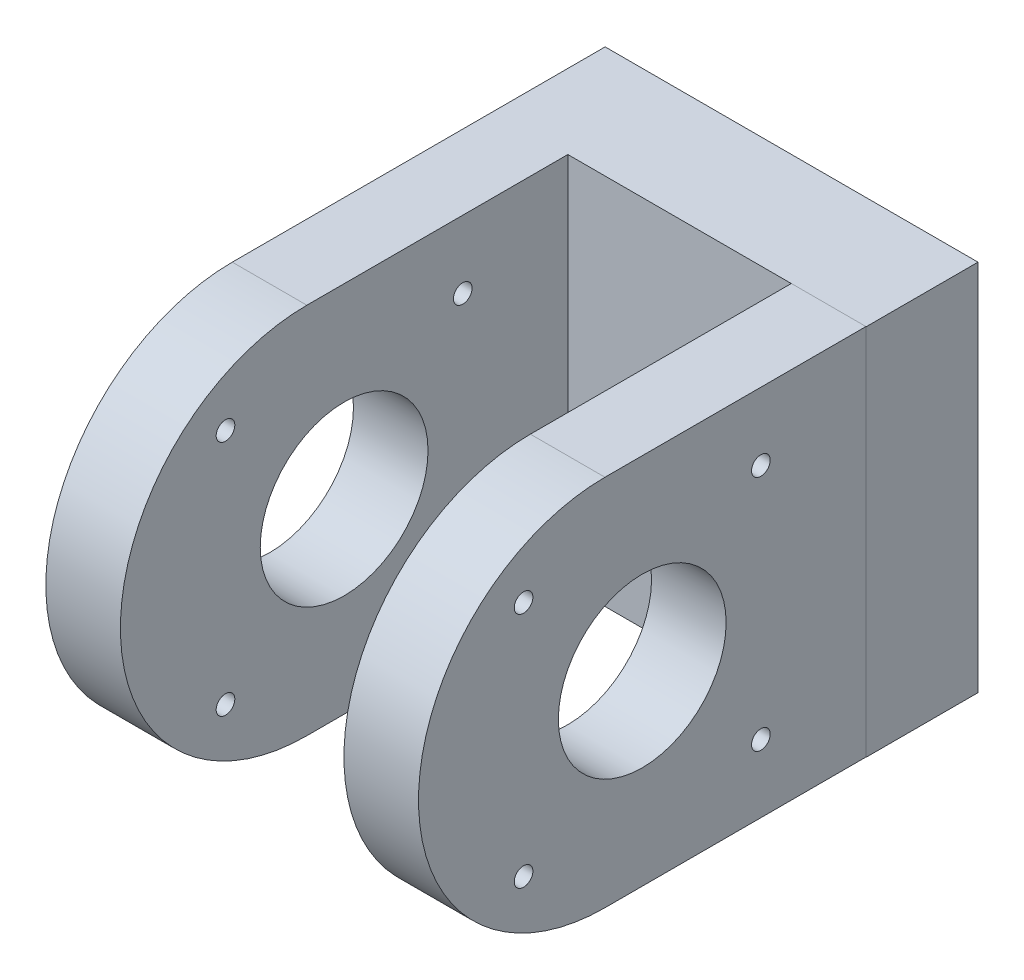
ISO-10303-21;
HEADER;
FILE_DESCRIPTION(('STEP AP214'),'2;1');
FILE_NAME('part.step','',(''),(''),'','','');
FILE_SCHEMA(('AUTOMOTIVE_DESIGN { 1 0 10303 214 1 1 1 1 }'));
ENDSEC;
DATA;
#1=APPLICATION_CONTEXT('core data for automotive mechanical design processes');
#2=APPLICATION_PROTOCOL_DEFINITION('international standard','automotive_design',2000,#1);
#3=PRODUCT_CONTEXT('',#1,'mechanical');
#4=PRODUCT('Part','Part','',(#3));
#5=PRODUCT_RELATED_PRODUCT_CATEGORY('part','',(#4));
#6=PRODUCT_DEFINITION_FORMATION('','',#4);
#7=PRODUCT_DEFINITION_CONTEXT('part definition',#1,'design');
#8=PRODUCT_DEFINITION('design','',#6,#7);
#9=PRODUCT_DEFINITION_SHAPE('','',#8);
#10=(LENGTH_UNIT() NAMED_UNIT(*) SI_UNIT(.MILLI.,.METRE.));
#11=(NAMED_UNIT(*) PLANE_ANGLE_UNIT() SI_UNIT($,.RADIAN.));
#12=(NAMED_UNIT(*) SI_UNIT($,.STERADIAN.) SOLID_ANGLE_UNIT());
#13=UNCERTAINTY_MEASURE_WITH_UNIT(LENGTH_MEASURE(1.E-05),#10,'distance_accuracy_value','');
#14=(GEOMETRIC_REPRESENTATION_CONTEXT(3) GLOBAL_UNCERTAINTY_ASSIGNED_CONTEXT((#13)) GLOBAL_UNIT_ASSIGNED_CONTEXT((#10,
#11,#12)) REPRESENTATION_CONTEXT('',''));
#15=CARTESIAN_POINT('',(0.,0.,0.));
#16=DIRECTION('',(0.,0.,1.));
#17=DIRECTION('',(1.,0.,0.));
#18=AXIS2_PLACEMENT_3D('',#15,#16,#17);
#19=CARTESIAN_POINT('',(15.,0.0348190205668461,50.0259957470013));
#20=DIRECTION('',(1.,0.,0.));
#21=DIRECTION('',(0.,0.,-1.));
#22=AXIS2_PLACEMENT_3D('',#19,#20,#21);
#23=CYLINDRICAL_SURFACE('',#22,25.);
#24=CARTESIAN_POINT('',(25.,0.0348190205668461,50.0259957470013));
#25=DIRECTION('',(1.,0.,0.));
#26=DIRECTION('',(0.,0.,-1.));
#27=AXIS2_PLACEMENT_3D('',#24,#25,#26);
#28=CIRCLE('',#27,25.);
#29=CARTESIAN_POINT('',(25.,-24.9651809794331,50.0259957470013));
#30=VERTEX_POINT('',#29);
#31=CARTESIAN_POINT('',(25.,25.0348190205668,50.0259957470013));
#32=VERTEX_POINT('',#31);
#33=EDGE_CURVE('E222',#30,#32,#28,.F.);
#34=ORIENTED_EDGE('',*,*,#33,.T.);
#35=DIRECTION('',(1.,0.,0.));
#36=VECTOR('',#35,1.);
#37=CARTESIAN_POINT('',(15.,25.0348190205668,50.0259957470013));
#38=LINE('',#37,#36);
#39=CARTESIAN_POINT('',(15.,25.0348190205668,50.0259957470013));
#40=VERTEX_POINT('',#39);
#41=EDGE_CURVE('E13',#40,#32,#38,.T.);
#42=ORIENTED_EDGE('',*,*,#41,.F.);
#43=CARTESIAN_POINT('',(15.,0.0348190205668461,50.0259957470013));
#44=DIRECTION('',(1.,0.,0.));
#45=DIRECTION('',(0.,0.,-1.));
#46=AXIS2_PLACEMENT_3D('',#43,#44,#45);
#47=CIRCLE('',#46,25.);
#48=CARTESIAN_POINT('',(15.,-24.9651809794331,50.0259957470013));
#49=VERTEX_POINT('',#48);
#50=EDGE_CURVE('E160',#49,#40,#47,.F.);
#51=ORIENTED_EDGE('',*,*,#50,.F.);
#52=DIRECTION('',(1.,0.,0.));
#53=VECTOR('',#52,1.);
#54=CARTESIAN_POINT('',(15.,-24.9651809794331,50.0259957470013));
#55=LINE('',#54,#53);
#56=EDGE_CURVE('E145',#49,#30,#55,.T.);
#57=ORIENTED_EDGE('',*,*,#56,.T.);
#58=EDGE_LOOP('',(#34,#42,#51,#57));
#59=FACE_BOUND('',#58,.T.);
#60=ADVANCED_FACE('F141',(#59),#23,.T.);
#61=CARTESIAN_POINT('',(15.,25.0348190205668,0.));
#62=DIRECTION('',(0.,1.,0.));
#63=DIRECTION('',(0.,0.,1.));
#64=AXIS2_PLACEMENT_3D('',#61,#62,#63);
#65=PLANE('',#64);
#66=DIRECTION('',(0.,0.,1.));
#67=VECTOR('',#66,1.);
#68=CARTESIAN_POINT('',(25.,25.0348190205668,0.));
#69=LINE('',#68,#67);
#70=CARTESIAN_POINT('',(25.,25.0348190205668,15.0259957470013));
#71=VERTEX_POINT('',#70);
#72=EDGE_CURVE('E227',#71,#32,#69,.T.);
#73=ORIENTED_EDGE('',*,*,#72,.F.);
#74=DIRECTION('',(1.,0.,0.));
#75=VECTOR('',#74,1.);
#76=CARTESIAN_POINT('',(15.,25.0348190205668,15.0259957470013));
#77=LINE('',#76,#75);
#78=CARTESIAN_POINT('',(15.,25.0348190205668,15.0259957470013));
#79=VERTEX_POINT('',#78);
#80=EDGE_CURVE('E151',#79,#71,#77,.T.);
#81=ORIENTED_EDGE('',*,*,#80,.F.);
#82=DIRECTION('',(0.,0.,1.));
#83=VECTOR('',#82,1.);
#84=CARTESIAN_POINT('',(15.,25.0348190205668,0.));
#85=LINE('',#84,#83);
#86=EDGE_CURVE('E191',#79,#40,#85,.T.);
#87=ORIENTED_EDGE('',*,*,#86,.T.);
#88=ORIENTED_EDGE('',*,*,#41,.T.);
#89=EDGE_LOOP('',(#73,#81,#87,#88));
#90=FACE_BOUND('',#89,.T.);
#91=ADVANCED_FACE('F267',(#90),#65,.T.);
#92=CARTESIAN_POINT('',(15.,0.,15.0259957470013));
#93=DIRECTION('',(0.,0.,1.));
#94=DIRECTION('',(1.,0.,0.));
#95=AXIS2_PLACEMENT_3D('',#92,#93,#94);
#96=PLANE('',#95);
#97=DIRECTION('',(0.,-1.,0.));
#98=VECTOR('',#97,1.);
#99=CARTESIAN_POINT('',(25.,0.,15.0259957470013));
#100=LINE('',#99,#98);
#101=CARTESIAN_POINT('',(25.,-24.9651809794331,15.0259957470013));
#102=VERTEX_POINT('',#101);
#103=EDGE_CURVE('E196',#71,#102,#100,.T.);
#104=ORIENTED_EDGE('',*,*,#103,.T.);
#105=DIRECTION('',(1.,0.,0.));
#106=VECTOR('',#105,1.);
#107=CARTESIAN_POINT('',(15.,-24.9651809794331,15.0259957470013));
#108=LINE('',#107,#106);
#109=CARTESIAN_POINT('',(15.,-24.9651809794331,15.0259957470013));
#110=VERTEX_POINT('',#109);
#111=EDGE_CURVE('E194',#110,#102,#108,.T.);
#112=ORIENTED_EDGE('',*,*,#111,.F.);
#113=DIRECTION('',(0.,-1.,0.));
#114=VECTOR('',#113,1.);
#115=CARTESIAN_POINT('',(15.,0.,15.0259957470013));
#116=LINE('',#115,#114);
#117=EDGE_CURVE('E187',#79,#110,#116,.T.);
#118=ORIENTED_EDGE('',*,*,#117,.F.);
#119=ORIENTED_EDGE('',*,*,#80,.T.);
#120=EDGE_LOOP('',(#104,#112,#118,#119));
#121=FACE_BOUND('',#120,.T.);
#122=ADVANCED_FACE('F195',(#121),#96,.F.);
#123=CARTESIAN_POINT('',(15.,-24.9651809794331,0.));
#124=DIRECTION('',(0.,1.,0.));
#125=DIRECTION('',(0.,0.,1.));
#126=AXIS2_PLACEMENT_3D('',#123,#124,#125);
#127=PLANE('',#126);
#128=DIRECTION('',(0.,0.,1.));
#129=VECTOR('',#128,1.);
#130=CARTESIAN_POINT('',(25.,-24.9651809794331,0.));
#131=LINE('',#130,#129);
#132=EDGE_CURVE('E224',#102,#30,#131,.T.);
#133=ORIENTED_EDGE('',*,*,#132,.T.);
#134=ORIENTED_EDGE('',*,*,#56,.F.);
#135=DIRECTION('',(0.,0.,1.));
#136=VECTOR('',#135,1.);
#137=CARTESIAN_POINT('',(15.,-24.9651809794331,0.));
#138=LINE('',#137,#136);
#139=EDGE_CURVE('E185',#110,#49,#138,.T.);
#140=ORIENTED_EDGE('',*,*,#139,.F.);
#141=ORIENTED_EDGE('',*,*,#111,.T.);
#142=EDGE_LOOP('',(#133,#134,#140,#141));
#143=FACE_BOUND('',#142,.T.);
#144=ADVANCED_FACE('F199',(#143),#127,.F.);
#145=CARTESIAN_POINT('',(15.,15.9447215972642,29.116093170304));
#146=DIRECTION('',(1.,0.,0.));
#147=DIRECTION('',(0.,0.,-1.));
#148=AXIS2_PLACEMENT_3D('',#145,#146,#147);
#149=CYLINDRICAL_SURFACE('',#148,1.25);
#150=CARTESIAN_POINT('',(15.,15.9447215972642,29.116093170304));
#151=DIRECTION('',(1.,0.,0.));
#152=DIRECTION('',(0.,0.,-1.));
#153=AXIS2_PLACEMENT_3D('',#150,#151,#152);
#154=CIRCLE('',#153,1.25);
#155=CARTESIAN_POINT('',(15.,15.9447215972642,27.866093170304));
#156=VERTEX_POINT('',#155);
#157=EDGE_CURVE('E202',#156,#156,#154,.F.);
#158=ORIENTED_EDGE('',*,*,#157,.T.);
#159=EDGE_LOOP('',(#158));
#160=FACE_BOUND('',#159,.T.);
#161=CARTESIAN_POINT('',(25.,15.9447215972642,29.116093170304));
#162=DIRECTION('',(1.,0.,0.));
#163=DIRECTION('',(0.,0.,-1.));
#164=AXIS2_PLACEMENT_3D('',#161,#162,#163);
#165=CIRCLE('',#164,1.25);
#166=CARTESIAN_POINT('',(25.,15.9447215972642,27.866093170304));
#167=VERTEX_POINT('',#166);
#168=EDGE_CURVE('E219',#167,#167,#165,.F.);
#169=ORIENTED_EDGE('',*,*,#168,.F.);
#170=EDGE_LOOP('',(#169));
#171=FACE_BOUND('',#170,.T.);
#172=ADVANCED_FACE('F249',(#160,#171),#149,.F.);
#173=CARTESIAN_POINT('',(15.,15.9447215972642,60.9358983236986));
#174=DIRECTION('',(1.,0.,0.));
#175=DIRECTION('',(0.,0.,-1.));
#176=AXIS2_PLACEMENT_3D('',#173,#174,#175);
#177=CYLINDRICAL_SURFACE('',#176,1.25);
#178=CARTESIAN_POINT('',(15.,15.9447215972642,60.9358983236986));
#179=DIRECTION('',(1.,0.,0.));
#180=DIRECTION('',(0.,0.,-1.));
#181=AXIS2_PLACEMENT_3D('',#178,#179,#180);
#182=CIRCLE('',#181,1.25);
#183=CARTESIAN_POINT('',(15.,15.9447215972642,59.6858983236986));
#184=VERTEX_POINT('',#183);
#185=EDGE_CURVE('E242',#184,#184,#182,.F.);
#186=ORIENTED_EDGE('',*,*,#185,.T.);
#187=EDGE_LOOP('',(#186));
#188=FACE_BOUND('',#187,.T.);
#189=CARTESIAN_POINT('',(25.,15.9447215972642,60.9358983236986));
#190=DIRECTION('',(1.,0.,0.));
#191=DIRECTION('',(0.,0.,-1.));
#192=AXIS2_PLACEMENT_3D('',#189,#190,#191);
#193=CIRCLE('',#192,1.25);
#194=CARTESIAN_POINT('',(25.,15.9447215972642,59.6858983236986));
#195=VERTEX_POINT('',#194);
#196=EDGE_CURVE('E216',#195,#195,#193,.F.);
#197=ORIENTED_EDGE('',*,*,#196,.F.);
#198=EDGE_LOOP('',(#197));
#199=FACE_BOUND('',#198,.T.);
#200=ADVANCED_FACE('F279',(#188,#199),#177,.F.);
#201=CARTESIAN_POINT('',(15.,-15.8750835561305,60.9358983236986));
#202=DIRECTION('',(1.,0.,0.));
#203=DIRECTION('',(0.,0.,-1.));
#204=AXIS2_PLACEMENT_3D('',#201,#202,#203);
#205=CYLINDRICAL_SURFACE('',#204,1.25);
#206=CARTESIAN_POINT('',(15.,-15.8750835561305,60.9358983236986));
#207=DIRECTION('',(1.,0.,0.));
#208=DIRECTION('',(0.,0.,-1.));
#209=AXIS2_PLACEMENT_3D('',#206,#207,#208);
#210=CIRCLE('',#209,1.25);
#211=CARTESIAN_POINT('',(15.,-15.8750835561305,59.6858983236986));
#212=VERTEX_POINT('',#211);
#213=EDGE_CURVE('E237',#212,#212,#210,.F.);
#214=ORIENTED_EDGE('',*,*,#213,.T.);
#215=EDGE_LOOP('',(#214));
#216=FACE_BOUND('',#215,.T.);
#217=CARTESIAN_POINT('',(25.,-15.8750835561305,60.9358983236986));
#218=DIRECTION('',(1.,0.,0.));
#219=DIRECTION('',(0.,0.,-1.));
#220=AXIS2_PLACEMENT_3D('',#217,#218,#219);
#221=CIRCLE('',#220,1.25);
#222=CARTESIAN_POINT('',(25.,-15.8750835561305,59.6858983236986));
#223=VERTEX_POINT('',#222);
#224=EDGE_CURVE('E213',#223,#223,#221,.F.);
#225=ORIENTED_EDGE('',*,*,#224,.F.);
#226=EDGE_LOOP('',(#225));
#227=FACE_BOUND('',#226,.T.);
#228=ADVANCED_FACE('F281',(#216,#227),#205,.F.);
#229=CARTESIAN_POINT('',(15.,-15.8750835561305,29.116093170304));
#230=DIRECTION('',(1.,0.,0.));
#231=DIRECTION('',(0.,0.,-1.));
#232=AXIS2_PLACEMENT_3D('',#229,#230,#231);
#233=CYLINDRICAL_SURFACE('',#232,1.25);
#234=CARTESIAN_POINT('',(15.,-15.8750835561305,29.116093170304));
#235=DIRECTION('',(1.,0.,0.));
#236=DIRECTION('',(0.,0.,-1.));
#237=AXIS2_PLACEMENT_3D('',#234,#235,#236);
#238=CIRCLE('',#237,1.25);
#239=CARTESIAN_POINT('',(15.,-15.8750835561305,27.866093170304));
#240=VERTEX_POINT('',#239);
#241=EDGE_CURVE('E232',#240,#240,#238,.F.);
#242=ORIENTED_EDGE('',*,*,#241,.T.);
#243=EDGE_LOOP('',(#242));
#244=FACE_BOUND('',#243,.T.);
#245=CARTESIAN_POINT('',(25.,-15.8750835561305,29.116093170304));
#246=DIRECTION('',(1.,0.,0.));
#247=DIRECTION('',(0.,0.,-1.));
#248=AXIS2_PLACEMENT_3D('',#245,#246,#247);
#249=CIRCLE('',#248,1.25);
#250=CARTESIAN_POINT('',(25.,-15.8750835561305,27.866093170304));
#251=VERTEX_POINT('',#250);
#252=EDGE_CURVE('E210',#251,#251,#249,.F.);
#253=ORIENTED_EDGE('',*,*,#252,.F.);
#254=EDGE_LOOP('',(#253));
#255=FACE_BOUND('',#254,.T.);
#256=ADVANCED_FACE('F143',(#244,#255),#233,.F.);
#257=CARTESIAN_POINT('',(15.,0.0348190205668461,45.0259957470013));
#258=DIRECTION('',(1.,0.,0.));
#259=DIRECTION('',(0.,0.,-1.));
#260=AXIS2_PLACEMENT_3D('',#257,#258,#259);
#261=CYLINDRICAL_SURFACE('',#260,11.25);
#262=CARTESIAN_POINT('',(15.,0.0348190205668461,45.0259957470013));
#263=DIRECTION('',(1.,0.,0.));
#264=DIRECTION('',(0.,0.,-1.));
#265=AXIS2_PLACEMENT_3D('',#262,#263,#264);
#266=CIRCLE('',#265,11.25);
#267=CARTESIAN_POINT('',(15.,0.0348190205668461,33.7759957470013));
#268=VERTEX_POINT('',#267);
#269=EDGE_CURVE('E207',#268,#268,#266,.F.);
#270=ORIENTED_EDGE('',*,*,#269,.T.);
#271=EDGE_LOOP('',(#270));
#272=FACE_BOUND('',#271,.T.);
#273=CARTESIAN_POINT('',(25.,0.0348190205668461,45.0259957470013));
#274=DIRECTION('',(1.,0.,0.));
#275=DIRECTION('',(0.,0.,-1.));
#276=AXIS2_PLACEMENT_3D('',#273,#274,#275);
#277=CIRCLE('',#276,11.25);
#278=CARTESIAN_POINT('',(25.,0.0348190205668461,33.7759957470013));
#279=VERTEX_POINT('',#278);
#280=EDGE_CURVE('E230',#279,#279,#277,.F.);
#281=ORIENTED_EDGE('',*,*,#280,.F.);
#282=EDGE_LOOP('',(#281));
#283=FACE_BOUND('',#282,.T.);
#284=ADVANCED_FACE('F254',(#272,#283),#261,.F.);
#285=CARTESIAN_POINT('',(15.,0.,0.));
#286=DIRECTION('',(1.,0.,0.));
#287=DIRECTION('',(0.,0.,-1.));
#288=AXIS2_PLACEMENT_3D('',#285,#286,#287);
#289=PLANE('',#288);
#290=ORIENTED_EDGE('',*,*,#241,.F.);
#291=EDGE_LOOP('',(#290));
#292=FACE_BOUND('',#291,.T.);
#293=ORIENTED_EDGE('',*,*,#213,.F.);
#294=EDGE_LOOP('',(#293));
#295=FACE_BOUND('',#294,.T.);
#296=ORIENTED_EDGE('',*,*,#185,.F.);
#297=EDGE_LOOP('',(#296));
#298=FACE_BOUND('',#297,.T.);
#299=ORIENTED_EDGE('',*,*,#157,.F.);
#300=EDGE_LOOP('',(#299));
#301=FACE_BOUND('',#300,.T.);
#302=ORIENTED_EDGE('',*,*,#50,.T.);
#303=ORIENTED_EDGE('',*,*,#86,.F.);
#304=ORIENTED_EDGE('',*,*,#117,.T.);
#305=ORIENTED_EDGE('',*,*,#139,.T.);
#306=EDGE_LOOP('',(#302,#303,#304,#305));
#307=FACE_BOUND('',#306,.T.);
#308=ORIENTED_EDGE('',*,*,#269,.F.);
#309=EDGE_LOOP('',(#308));
#310=FACE_BOUND('',#309,.T.);
#311=ADVANCED_FACE('F189',(#292,#295,#298,#301,#307,#310),#289,.F.);
#312=CARTESIAN_POINT('',(25.,0.,0.));
#313=DIRECTION('',(1.,0.,0.));
#314=DIRECTION('',(0.,0.,-1.));
#315=AXIS2_PLACEMENT_3D('',#312,#313,#314);
#316=PLANE('',#315);
#317=ORIENTED_EDGE('',*,*,#252,.T.);
#318=EDGE_LOOP('',(#317));
#319=FACE_BOUND('',#318,.T.);
#320=ORIENTED_EDGE('',*,*,#224,.T.);
#321=EDGE_LOOP('',(#320));
#322=FACE_BOUND('',#321,.T.);
#323=ORIENTED_EDGE('',*,*,#196,.T.);
#324=EDGE_LOOP('',(#323));
#325=FACE_BOUND('',#324,.T.);
#326=ORIENTED_EDGE('',*,*,#168,.T.);
#327=EDGE_LOOP('',(#326));
#328=FACE_BOUND('',#327,.T.);
#329=ORIENTED_EDGE('',*,*,#33,.F.);
#330=ORIENTED_EDGE('',*,*,#132,.F.);
#331=ORIENTED_EDGE('',*,*,#103,.F.);
#332=ORIENTED_EDGE('',*,*,#72,.T.);
#333=EDGE_LOOP('',(#329,#330,#331,#332));
#334=FACE_BOUND('',#333,.T.);
#335=ORIENTED_EDGE('',*,*,#280,.T.);
#336=EDGE_LOOP('',(#335));
#337=FACE_BOUND('',#336,.T.);
#338=ADVANCED_FACE('F253',(#319,#322,#325,#328,#334,#337),#316,.T.);
#339=CLOSED_SHELL('',(#60,#91,#122,#144,#172,#200,#228,#256,#284,#311,#338));
#340=MANIFOLD_SOLID_BREP('B2',#339);
#341=CARTESIAN_POINT('',(0.,0.,15.));
#342=DIRECTION('',(0.,0.,1.));
#343=DIRECTION('',(1.,0.,0.));
#344=AXIS2_PLACEMENT_3D('',#341,#342,#343);
#345=PLANE('',#344);
#346=CARTESIAN_POINT('',(0.,0.,15.));
#347=DIRECTION('',(0.,0.,1.));
#348=DIRECTION('',(1.,0.,0.));
#349=AXIS2_PLACEMENT_3D('',#346,#347,#348);
#350=CIRCLE('',#349,2.5);
#351=CARTESIAN_POINT('',(2.5,0.,15.));
#352=VERTEX_POINT('',#351);
#353=EDGE_CURVE('E436',#352,#352,#350,.T.);
#354=ORIENTED_EDGE('',*,*,#353,.F.);
#355=EDGE_LOOP('',(#354));
#356=FACE_BOUND('',#355,.T.);
#357=DIRECTION('',(1.,0.,0.));
#358=VECTOR('',#357,1.);
#359=CARTESIAN_POINT('',(-25.,25.,15.));
#360=LINE('',#359,#358);
#361=CARTESIAN_POINT('',(-15.,25.,15.));
#362=VERTEX_POINT('',#361);
#363=CARTESIAN_POINT('',(25.,25.,15.));
#364=VERTEX_POINT('',#363);
#365=EDGE_CURVE('E443',#362,#364,#360,.T.);
#366=ORIENTED_EDGE('',*,*,#365,.F.);
#367=DIRECTION('',(0.,-1.,0.));
#368=VECTOR('',#367,1.);
#369=CARTESIAN_POINT('',(-15.,25.,15.));
#370=LINE('',#369,#368);
#371=CARTESIAN_POINT('',(-15.,-25.,15.));
#372=VERTEX_POINT('',#371);
#373=EDGE_CURVE('E466',#362,#372,#370,.T.);
#374=ORIENTED_EDGE('',*,*,#373,.T.);
#375=DIRECTION('',(1.,0.,0.));
#376=VECTOR('',#375,1.);
#377=CARTESIAN_POINT('',(-25.,-25.,15.));
#378=LINE('',#377,#376);
#379=CARTESIAN_POINT('',(25.,-25.,15.));
#380=VERTEX_POINT('',#379);
#381=EDGE_CURVE('E396',#372,#380,#378,.T.);
#382=ORIENTED_EDGE('',*,*,#381,.T.);
#383=DIRECTION('',(0.,1.,0.));
#384=VECTOR('',#383,1.);
#385=CARTESIAN_POINT('',(25.,-25.,15.));
#386=LINE('',#385,#384);
#387=EDGE_CURVE('E447',#380,#364,#386,.T.);
#388=ORIENTED_EDGE('',*,*,#387,.T.);
#389=EDGE_LOOP('',(#366,#374,#382,#388));
#390=FACE_BOUND('',#389,.T.);
#391=ADVANCED_FACE('F370',(#356,#390),#345,.T.);
#392=CARTESIAN_POINT('',(0.,0.,0.));
#393=DIRECTION('',(0.,0.,1.));
#394=DIRECTION('',(1.,0.,0.));
#395=AXIS2_PLACEMENT_3D('',#392,#393,#394);
#396=PLANE('',#395);
#397=DIRECTION('',(1.,0.,0.));
#398=VECTOR('',#397,1.);
#399=CARTESIAN_POINT('',(-25.,25.,0.));
#400=LINE('',#399,#398);
#401=CARTESIAN_POINT('',(-25.,25.,0.));
#402=VERTEX_POINT('',#401);
#403=CARTESIAN_POINT('',(25.,25.,0.));
#404=VERTEX_POINT('',#403);
#405=EDGE_CURVE('E429',#402,#404,#400,.T.);
#406=ORIENTED_EDGE('',*,*,#405,.T.);
#407=DIRECTION('',(0.,1.,0.));
#408=VECTOR('',#407,1.);
#409=CARTESIAN_POINT('',(25.,-25.,0.));
#410=LINE('',#409,#408);
#411=CARTESIAN_POINT('',(25.,-25.,0.));
#412=VERTEX_POINT('',#411);
#413=EDGE_CURVE('E435',#412,#404,#410,.T.);
#414=ORIENTED_EDGE('',*,*,#413,.F.);
#415=DIRECTION('',(1.,0.,0.));
#416=VECTOR('',#415,1.);
#417=CARTESIAN_POINT('',(-25.,-25.,0.));
#418=LINE('',#417,#416);
#419=CARTESIAN_POINT('',(-25.,-25.,0.));
#420=VERTEX_POINT('',#419);
#421=EDGE_CURVE('E441',#420,#412,#418,.T.);
#422=ORIENTED_EDGE('',*,*,#421,.F.);
#423=DIRECTION('',(0.,1.,0.));
#424=VECTOR('',#423,1.);
#425=CARTESIAN_POINT('',(-25.,-25.,0.));
#426=LINE('',#425,#424);
#427=EDGE_CURVE('E421',#420,#402,#426,.T.);
#428=ORIENTED_EDGE('',*,*,#427,.T.);
#429=EDGE_LOOP('',(#406,#414,#422,#428));
#430=FACE_BOUND('',#429,.T.);
#431=CARTESIAN_POINT('',(0.,0.,0.));
#432=DIRECTION('',(0.,0.,1.));
#433=DIRECTION('',(1.,0.,0.));
#434=AXIS2_PLACEMENT_3D('',#431,#432,#433);
#435=CIRCLE('',#434,2.5);
#436=CARTESIAN_POINT('',(2.5,0.,0.));
#437=VERTEX_POINT('',#436);
#438=EDGE_CURVE('E494',#437,#437,#435,.T.);
#439=ORIENTED_EDGE('',*,*,#438,.T.);
#440=EDGE_LOOP('',(#439));
#441=FACE_BOUND('',#440,.T.);
#442=ADVANCED_FACE('F439',(#430,#441),#396,.F.);
#443=CARTESIAN_POINT('',(-25.,25.,15.));
#444=DIRECTION('',(0.,1.,0.));
#445=DIRECTION('',(0.,0.,1.));
#446=AXIS2_PLACEMENT_3D('',#443,#444,#445);
#447=PLANE('',#446);
#448=ORIENTED_EDGE('',*,*,#405,.F.);
#449=DIRECTION('',(0.,0.,-1.));
#450=VECTOR('',#449,1.);
#451=CARTESIAN_POINT('',(-25.,25.,15.));
#452=LINE('',#451,#450);
#453=CARTESIAN_POINT('',(-25.,25.,50.));
#454=VERTEX_POINT('',#453);
#455=EDGE_CURVE('E139',#454,#402,#452,.T.);
#456=ORIENTED_EDGE('',*,*,#455,.F.);
#457=DIRECTION('',(-1.,0.,0.));
#458=VECTOR('',#457,1.);
#459=CARTESIAN_POINT('',(-15.,25.,50.));
#460=LINE('',#459,#458);
#461=CARTESIAN_POINT('',(-15.,25.,50.));
#462=VERTEX_POINT('',#461);
#463=EDGE_CURVE('E473',#462,#454,#460,.T.);
#464=ORIENTED_EDGE('',*,*,#463,.F.);
#465=DIRECTION('',(0.,0.,1.));
#466=VECTOR('',#465,1.);
#467=CARTESIAN_POINT('',(-15.,25.,15.));
#468=LINE('',#467,#466);
#469=EDGE_CURVE('E471',#362,#462,#468,.T.);
#470=ORIENTED_EDGE('',*,*,#469,.F.);
#471=ORIENTED_EDGE('',*,*,#365,.T.);
#472=DIRECTION('',(0.,0.,-1.));
#473=VECTOR('',#472,1.);
#474=CARTESIAN_POINT('',(25.,25.,15.));
#475=LINE('',#474,#473);
#476=EDGE_CURVE('E374',#364,#404,#475,.T.);
#477=ORIENTED_EDGE('',*,*,#476,.T.);
#478=EDGE_LOOP('',(#448,#456,#464,#470,#471,#477));
#479=FACE_BOUND('',#478,.T.);
#480=ADVANCED_FACE('F372',(#479),#447,.T.);
#481=CARTESIAN_POINT('',(-25.,-25.,15.));
#482=DIRECTION('',(-1.,0.,0.));
#483=DIRECTION('',(0.,0.,1.));
#484=AXIS2_PLACEMENT_3D('',#481,#482,#483);
#485=PLANE('',#484);
#486=ORIENTED_EDGE('',*,*,#427,.F.);
#487=DIRECTION('',(0.,0.,-1.));
#488=VECTOR('',#487,1.);
#489=CARTESIAN_POINT('',(-25.,-25.,15.));
#490=LINE('',#489,#488);
#491=CARTESIAN_POINT('',(-25.,-25.,50.));
#492=VERTEX_POINT('',#491);
#493=EDGE_CURVE('E380',#492,#420,#490,.T.);
#494=ORIENTED_EDGE('',*,*,#493,.F.);
#495=CARTESIAN_POINT('',(-25.,0.,50.));
#496=DIRECTION('',(-1.,0.,0.));
#497=DIRECTION('',(0.,0.,1.));
#498=AXIS2_PLACEMENT_3D('',#495,#496,#497);
#499=CIRCLE('',#498,25.);
#500=EDGE_CURVE('E424',#492,#454,#499,.T.);
#501=ORIENTED_EDGE('',*,*,#500,.T.);
#502=ORIENTED_EDGE('',*,*,#455,.T.);
#503=EDGE_LOOP('',(#486,#494,#501,#502));
#504=FACE_BOUND('',#503,.T.);
#505=CARTESIAN_POINT('',(-25.,15.9099025766973,29.0900974233027));
#506=DIRECTION('',(-1.,0.,0.));
#507=DIRECTION('',(0.,0.,1.));
#508=AXIS2_PLACEMENT_3D('',#505,#506,#507);
#509=CIRCLE('',#508,1.25);
#510=CARTESIAN_POINT('',(-25.,15.9099025766973,30.3400974233027));
#511=VERTEX_POINT('',#510);
#512=EDGE_CURVE('E568',#511,#511,#509,.T.);
#513=ORIENTED_EDGE('',*,*,#512,.F.);
#514=EDGE_LOOP('',(#513));
#515=FACE_BOUND('',#514,.T.);
#516=CARTESIAN_POINT('',(-25.,-15.9099025766973,29.0900974233027));
#517=DIRECTION('',(-1.,0.,0.));
#518=DIRECTION('',(0.,0.,1.));
#519=AXIS2_PLACEMENT_3D('',#516,#517,#518);
#520=CIRCLE('',#519,1.25);
#521=CARTESIAN_POINT('',(-25.,-15.9099025766973,30.3400974233027));
#522=VERTEX_POINT('',#521);
#523=EDGE_CURVE('E560',#522,#522,#520,.T.);
#524=ORIENTED_EDGE('',*,*,#523,.F.);
#525=EDGE_LOOP('',(#524));
#526=FACE_BOUND('',#525,.T.);
#527=CARTESIAN_POINT('',(-25.,-15.9099025766973,60.9099025766973));
#528=DIRECTION('',(-1.,0.,0.));
#529=DIRECTION('',(0.,0.,1.));
#530=AXIS2_PLACEMENT_3D('',#527,#528,#529);
#531=CIRCLE('',#530,1.25);
#532=CARTESIAN_POINT('',(-25.,-15.9099025766973,62.1599025766973));
#533=VERTEX_POINT('',#532);
#534=EDGE_CURVE('E552',#533,#533,#531,.T.);
#535=ORIENTED_EDGE('',*,*,#534,.F.);
#536=EDGE_LOOP('',(#535));
#537=FACE_BOUND('',#536,.T.);
#538=CARTESIAN_POINT('',(-25.,15.9099025766973,60.9099025766973));
#539=DIRECTION('',(-1.,0.,0.));
#540=DIRECTION('',(0.,0.,1.));
#541=AXIS2_PLACEMENT_3D('',#538,#539,#540);
#542=CIRCLE('',#541,1.25);
#543=CARTESIAN_POINT('',(-25.,15.9099025766973,62.1599025766973));
#544=VERTEX_POINT('',#543);
#545=EDGE_CURVE('E544',#544,#544,#542,.T.);
#546=ORIENTED_EDGE('',*,*,#545,.F.);
#547=EDGE_LOOP('',(#546));
#548=FACE_BOUND('',#547,.T.);
#549=CARTESIAN_POINT('',(-25.,0.,45.));
#550=DIRECTION('',(-1.,0.,0.));
#551=DIRECTION('',(0.,0.,1.));
#552=AXIS2_PLACEMENT_3D('',#549,#550,#551);
#553=CIRCLE('',#552,11.25);
#554=CARTESIAN_POINT('',(-25.,0.,56.25));
#555=VERTEX_POINT('',#554);
#556=EDGE_CURVE('E536',#555,#555,#553,.T.);
#557=ORIENTED_EDGE('',*,*,#556,.F.);
#558=EDGE_LOOP('',(#557));
#559=FACE_BOUND('',#558,.T.);
#560=ADVANCED_FACE('F417',(#504,#515,#526,#537,#548,#559),#485,.T.);
#561=CARTESIAN_POINT('',(-25.,-25.,15.));
#562=DIRECTION('',(0.,1.,0.));
#563=DIRECTION('',(0.,0.,1.));
#564=AXIS2_PLACEMENT_3D('',#561,#562,#563);
#565=PLANE('',#564);
#566=ORIENTED_EDGE('',*,*,#421,.T.);
#567=DIRECTION('',(0.,0.,-1.));
#568=VECTOR('',#567,1.);
#569=CARTESIAN_POINT('',(25.,-25.,15.));
#570=LINE('',#569,#568);
#571=EDGE_CURVE('E453',#380,#412,#570,.T.);
#572=ORIENTED_EDGE('',*,*,#571,.F.);
#573=ORIENTED_EDGE('',*,*,#381,.F.);
#574=DIRECTION('',(0.,0.,1.));
#575=VECTOR('',#574,1.);
#576=CARTESIAN_POINT('',(-15.,-25.,15.));
#577=LINE('',#576,#575);
#578=CARTESIAN_POINT('',(-15.,-25.,50.));
#579=VERTEX_POINT('',#578);
#580=EDGE_CURVE('E388',#372,#579,#577,.T.);
#581=ORIENTED_EDGE('',*,*,#580,.T.);
#582=DIRECTION('',(-1.,0.,0.));
#583=VECTOR('',#582,1.);
#584=CARTESIAN_POINT('',(-15.,-25.,50.));
#585=LINE('',#584,#583);
#586=EDGE_CURVE('E480',#579,#492,#585,.T.);
#587=ORIENTED_EDGE('',*,*,#586,.T.);
#588=ORIENTED_EDGE('',*,*,#493,.T.);
#589=EDGE_LOOP('',(#566,#572,#573,#581,#587,#588));
#590=FACE_BOUND('',#589,.T.);
#591=ADVANCED_FACE('F513',(#590),#565,.F.);
#592=CARTESIAN_POINT('',(25.,-25.,15.));
#593=DIRECTION('',(-1.,0.,0.));
#594=DIRECTION('',(0.,0.,1.));
#595=AXIS2_PLACEMENT_3D('',#592,#593,#594);
#596=PLANE('',#595);
#597=ORIENTED_EDGE('',*,*,#413,.T.);
#598=ORIENTED_EDGE('',*,*,#476,.F.);
#599=ORIENTED_EDGE('',*,*,#387,.F.);
#600=ORIENTED_EDGE('',*,*,#571,.T.);
#601=EDGE_LOOP('',(#597,#598,#599,#600));
#602=FACE_BOUND('',#601,.T.);
#603=ADVANCED_FACE('F464',(#602),#596,.F.);
#604=CARTESIAN_POINT('',(0.,0.,15.));
#605=DIRECTION('',(0.,0.,-1.));
#606=DIRECTION('',(-1.,0.,0.));
#607=AXIS2_PLACEMENT_3D('',#604,#605,#606);
#608=CYLINDRICAL_SURFACE('',#607,2.5);
#609=ORIENTED_EDGE('',*,*,#353,.T.);
#610=EDGE_LOOP('',(#609));
#611=FACE_BOUND('',#610,.T.);
#612=ORIENTED_EDGE('',*,*,#438,.F.);
#613=EDGE_LOOP('',(#612));
#614=FACE_BOUND('',#613,.T.);
#615=ADVANCED_FACE('F502',(#611,#614),#608,.F.);
#616=CARTESIAN_POINT('',(-15.,0.,50.));
#617=DIRECTION('',(-1.,0.,0.));
#618=DIRECTION('',(0.,0.,1.));
#619=AXIS2_PLACEMENT_3D('',#616,#617,#618);
#620=CYLINDRICAL_SURFACE('',#619,25.);
#621=ORIENTED_EDGE('',*,*,#500,.F.);
#622=ORIENTED_EDGE('',*,*,#586,.F.);
#623=CARTESIAN_POINT('',(-15.,0.,50.));
#624=DIRECTION('',(-1.,0.,0.));
#625=DIRECTION('',(0.,0.,1.));
#626=AXIS2_PLACEMENT_3D('',#623,#624,#625);
#627=CIRCLE('',#626,25.);
#628=EDGE_CURVE('E476',#579,#462,#627,.T.);
#629=ORIENTED_EDGE('',*,*,#628,.T.);
#630=ORIENTED_EDGE('',*,*,#463,.T.);
#631=EDGE_LOOP('',(#621,#622,#629,#630));
#632=FACE_BOUND('',#631,.T.);
#633=ADVANCED_FACE('F504',(#632),#620,.T.);
#634=CARTESIAN_POINT('',(-15.,0.,50.));
#635=DIRECTION('',(-1.,0.,0.));
#636=DIRECTION('',(0.,0.,1.));
#637=AXIS2_PLACEMENT_3D('',#634,#635,#636);
#638=PLANE('',#637);
#639=CARTESIAN_POINT('',(-15.,15.9099025766973,29.0900974233027));
#640=DIRECTION('',(-1.,0.,0.));
#641=DIRECTION('',(0.,0.,1.));
#642=AXIS2_PLACEMENT_3D('',#639,#640,#641);
#643=CIRCLE('',#642,1.25);
#644=CARTESIAN_POINT('',(-15.,15.9099025766973,30.3400974233027));
#645=VERTEX_POINT('',#644);
#646=EDGE_CURVE('E564',#645,#645,#643,.T.);
#647=ORIENTED_EDGE('',*,*,#646,.T.);
#648=EDGE_LOOP('',(#647));
#649=FACE_BOUND('',#648,.T.);
#650=CARTESIAN_POINT('',(-15.,-15.9099025766973,29.0900974233027));
#651=DIRECTION('',(-1.,0.,0.));
#652=DIRECTION('',(0.,0.,1.));
#653=AXIS2_PLACEMENT_3D('',#650,#651,#652);
#654=CIRCLE('',#653,1.25);
#655=CARTESIAN_POINT('',(-15.,-15.9099025766973,30.3400974233027));
#656=VERTEX_POINT('',#655);
#657=EDGE_CURVE('E556',#656,#656,#654,.T.);
#658=ORIENTED_EDGE('',*,*,#657,.T.);
#659=EDGE_LOOP('',(#658));
#660=FACE_BOUND('',#659,.T.);
#661=CARTESIAN_POINT('',(-15.,-15.9099025766973,60.9099025766973));
#662=DIRECTION('',(-1.,0.,0.));
#663=DIRECTION('',(0.,0.,1.));
#664=AXIS2_PLACEMENT_3D('',#661,#662,#663);
#665=CIRCLE('',#664,1.25);
#666=CARTESIAN_POINT('',(-15.,-15.9099025766973,62.1599025766973));
#667=VERTEX_POINT('',#666);
#668=EDGE_CURVE('E548',#667,#667,#665,.T.);
#669=ORIENTED_EDGE('',*,*,#668,.T.);
#670=EDGE_LOOP('',(#669));
#671=FACE_BOUND('',#670,.T.);
#672=CARTESIAN_POINT('',(-15.,15.9099025766973,60.9099025766973));
#673=DIRECTION('',(-1.,0.,0.));
#674=DIRECTION('',(0.,0.,1.));
#675=AXIS2_PLACEMENT_3D('',#672,#673,#674);
#676=CIRCLE('',#675,1.25);
#677=CARTESIAN_POINT('',(-15.,15.9099025766973,62.1599025766973));
#678=VERTEX_POINT('',#677);
#679=EDGE_CURVE('E540',#678,#678,#676,.T.);
#680=ORIENTED_EDGE('',*,*,#679,.T.);
#681=EDGE_LOOP('',(#680));
#682=FACE_BOUND('',#681,.T.);
#683=CARTESIAN_POINT('',(-15.,0.,45.));
#684=DIRECTION('',(-1.,0.,0.));
#685=DIRECTION('',(0.,0.,1.));
#686=AXIS2_PLACEMENT_3D('',#683,#684,#685);
#687=CIRCLE('',#686,11.25);
#688=CARTESIAN_POINT('',(-15.,0.,56.25));
#689=VERTEX_POINT('',#688);
#690=EDGE_CURVE('E490',#689,#689,#687,.T.);
#691=ORIENTED_EDGE('',*,*,#690,.T.);
#692=EDGE_LOOP('',(#691));
#693=FACE_BOUND('',#692,.T.);
#694=ORIENTED_EDGE('',*,*,#469,.T.);
#695=ORIENTED_EDGE('',*,*,#628,.F.);
#696=ORIENTED_EDGE('',*,*,#580,.F.);
#697=ORIENTED_EDGE('',*,*,#373,.F.);
#698=EDGE_LOOP('',(#694,#695,#696,#697));
#699=FACE_BOUND('',#698,.T.);
#700=ADVANCED_FACE('F478',(#649,#660,#671,#682,#693,#699),#638,.F.);
#701=CARTESIAN_POINT('',(-15.,0.,45.));
#702=DIRECTION('',(-1.,0.,0.));
#703=DIRECTION('',(0.,0.,1.));
#704=AXIS2_PLACEMENT_3D('',#701,#702,#703);
#705=CYLINDRICAL_SURFACE('',#704,11.25);
#706=ORIENTED_EDGE('',*,*,#690,.F.);
#707=EDGE_LOOP('',(#706));
#708=FACE_BOUND('',#707,.T.);
#709=ORIENTED_EDGE('',*,*,#556,.T.);
#710=EDGE_LOOP('',(#709));
#711=FACE_BOUND('',#710,.T.);
#712=ADVANCED_FACE('F593',(#708,#711),#705,.F.);
#713=CARTESIAN_POINT('',(-15.,15.9099025766973,60.9099025766973));
#714=DIRECTION('',(-1.,0.,0.));
#715=DIRECTION('',(0.,0.,1.));
#716=AXIS2_PLACEMENT_3D('',#713,#714,#715);
#717=CYLINDRICAL_SURFACE('',#716,1.25);
#718=ORIENTED_EDGE('',*,*,#679,.F.);
#719=EDGE_LOOP('',(#718));
#720=FACE_BOUND('',#719,.T.);
#721=ORIENTED_EDGE('',*,*,#545,.T.);
#722=EDGE_LOOP('',(#721));
#723=FACE_BOUND('',#722,.T.);
#724=ADVANCED_FACE('F595',(#720,#723),#717,.F.);
#725=CARTESIAN_POINT('',(-15.,-15.9099025766973,60.9099025766973));
#726=DIRECTION('',(-1.,0.,0.));
#727=DIRECTION('',(0.,0.,1.));
#728=AXIS2_PLACEMENT_3D('',#725,#726,#727);
#729=CYLINDRICAL_SURFACE('',#728,1.25);
#730=ORIENTED_EDGE('',*,*,#668,.F.);
#731=EDGE_LOOP('',(#730));
#732=FACE_BOUND('',#731,.T.);
#733=ORIENTED_EDGE('',*,*,#534,.T.);
#734=EDGE_LOOP('',(#733));
#735=FACE_BOUND('',#734,.T.);
#736=ADVANCED_FACE('F602',(#732,#735),#729,.F.);
#737=CARTESIAN_POINT('',(-15.,-15.9099025766973,29.0900974233027));
#738=DIRECTION('',(-1.,0.,0.));
#739=DIRECTION('',(0.,0.,1.));
#740=AXIS2_PLACEMENT_3D('',#737,#738,#739);
#741=CYLINDRICAL_SURFACE('',#740,1.25);
#742=ORIENTED_EDGE('',*,*,#657,.F.);
#743=EDGE_LOOP('',(#742));
#744=FACE_BOUND('',#743,.T.);
#745=ORIENTED_EDGE('',*,*,#523,.T.);
#746=EDGE_LOOP('',(#745));
#747=FACE_BOUND('',#746,.T.);
#748=ADVANCED_FACE('F581',(#744,#747),#741,.F.);
#749=CARTESIAN_POINT('',(-15.,15.9099025766973,29.0900974233027));
#750=DIRECTION('',(-1.,0.,0.));
#751=DIRECTION('',(0.,0.,1.));
#752=AXIS2_PLACEMENT_3D('',#749,#750,#751);
#753=CYLINDRICAL_SURFACE('',#752,1.25);
#754=ORIENTED_EDGE('',*,*,#646,.F.);
#755=EDGE_LOOP('',(#754));
#756=FACE_BOUND('',#755,.T.);
#757=ORIENTED_EDGE('',*,*,#512,.T.);
#758=EDGE_LOOP('',(#757));
#759=FACE_BOUND('',#758,.T.);
#760=ADVANCED_FACE('F578',(#756,#759),#753,.F.);
#761=CLOSED_SHELL('',(#391,#442,#480,#560,#591,#603,#615,#633,#700,#712,#724,#736,#748,#760));
#762=MANIFOLD_SOLID_BREP('B7',#761);
#763=ADVANCED_BREP_SHAPE_REPRESENTATION('',(#18,#340,#762),#14);
#764=SHAPE_DEFINITION_REPRESENTATION(#9,#763);
ENDSEC;
END-ISO-10303-21;
